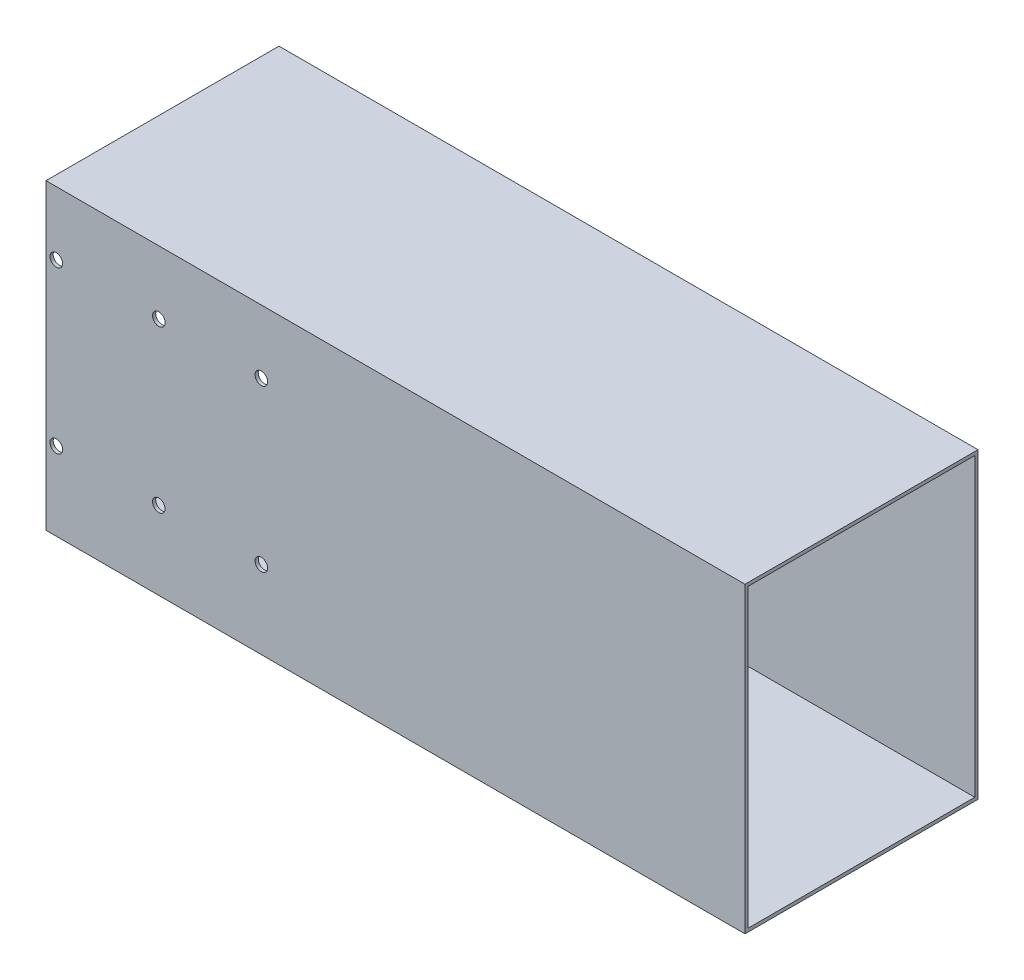
ISO-10303-21;
HEADER;
FILE_DESCRIPTION(('STEP AP214'),'2;1');
FILE_NAME('part.step','',(''),(''),'','','');
FILE_SCHEMA(('AUTOMOTIVE_DESIGN { 1 0 10303 214 1 1 1 1 }'));
ENDSEC;
DATA;
#1=APPLICATION_CONTEXT('core data for automotive mechanical design processes');
#2=APPLICATION_PROTOCOL_DEFINITION('international standard','automotive_design',2000,#1);
#3=PRODUCT_CONTEXT('',#1,'mechanical');
#4=PRODUCT('Part','Part','',(#3));
#5=PRODUCT_RELATED_PRODUCT_CATEGORY('part','',(#4));
#6=PRODUCT_DEFINITION_FORMATION('','',#4);
#7=PRODUCT_DEFINITION_CONTEXT('part definition',#1,'design');
#8=PRODUCT_DEFINITION('design','',#6,#7);
#9=PRODUCT_DEFINITION_SHAPE('','',#8);
#10=(LENGTH_UNIT() NAMED_UNIT(*) SI_UNIT(.MILLI.,.METRE.));
#11=(NAMED_UNIT(*) PLANE_ANGLE_UNIT() SI_UNIT($,.RADIAN.));
#12=(NAMED_UNIT(*) SI_UNIT($,.STERADIAN.) SOLID_ANGLE_UNIT());
#13=UNCERTAINTY_MEASURE_WITH_UNIT(LENGTH_MEASURE(1.E-05),#10,'distance_accuracy_value','');
#14=(GEOMETRIC_REPRESENTATION_CONTEXT(3) GLOBAL_UNCERTAINTY_ASSIGNED_CONTEXT((#13)) GLOBAL_UNIT_ASSIGNED_CONTEXT((#10,
#11,#12)) REPRESENTATION_CONTEXT('',''));
#15=CARTESIAN_POINT('',(0.,0.,0.));
#16=DIRECTION('',(0.,0.,1.));
#17=DIRECTION('',(1.,0.,0.));
#18=AXIS2_PLACEMENT_3D('',#15,#16,#17);
#19=CARTESIAN_POINT('',(-11.7023765952702,-3.63870772259184,50.));
#20=DIRECTION('',(0.,0.,-1.));
#21=DIRECTION('',(-1.,0.,0.));
#22=AXIS2_PLACEMENT_3D('',#19,#20,#21);
#23=CYLINDRICAL_SURFACE('',#22,1.35);
#24=CARTESIAN_POINT('',(-11.7023765952702,-3.63870772259184,0.682946832849751));
#25=DIRECTION('',(0.,0.,-1.));
#26=DIRECTION('',(-1.,0.,0.));
#27=AXIS2_PLACEMENT_3D('',#24,#25,#26);
#28=CIRCLE('',#27,1.35);
#29=CARTESIAN_POINT('',(-13.0523765952702,-3.63870772259184,0.682946832849751));
#30=VERTEX_POINT('',#29);
#31=EDGE_CURVE('E192',#30,#30,#28,.T.);
#32=ORIENTED_EDGE('',*,*,#31,.F.);
#33=EDGE_LOOP('',(#32));
#34=FACE_BOUND('',#33,.T.);
#35=CARTESIAN_POINT('',(-11.7023765952702,-3.63870772259184,0.));
#36=DIRECTION('',(0.,0.,1.));
#37=DIRECTION('',(1.,0.,0.));
#38=AXIS2_PLACEMENT_3D('',#35,#36,#37);
#39=CIRCLE('',#38,1.35);
#40=CARTESIAN_POINT('',(-10.3523765952702,-3.63870772259184,0.));
#41=VERTEX_POINT('',#40);
#42=EDGE_CURVE('E249',#41,#41,#39,.T.);
#43=ORIENTED_EDGE('',*,*,#42,.F.);
#44=EDGE_LOOP('',(#43));
#45=FACE_BOUND('',#44,.T.);
#46=ADVANCED_FACE('F39',(#34,#45),#23,.F.);
#47=CARTESIAN_POINT('',(10.2976234047298,-3.63870772259184,50.));
#48=DIRECTION('',(0.,0.,-1.));
#49=DIRECTION('',(-1.,0.,0.));
#50=AXIS2_PLACEMENT_3D('',#47,#48,#49);
#51=CYLINDRICAL_SURFACE('',#50,1.35);
#52=CARTESIAN_POINT('',(10.2976234047298,-3.63870772259184,0.682946832849751));
#53=DIRECTION('',(0.,0.,-1.));
#54=DIRECTION('',(-1.,0.,0.));
#55=AXIS2_PLACEMENT_3D('',#52,#53,#54);
#56=CIRCLE('',#55,1.35);
#57=CARTESIAN_POINT('',(8.94762340472977,-3.63870772259184,0.682946832849751));
#58=VERTEX_POINT('',#57);
#59=EDGE_CURVE('E188',#58,#58,#56,.T.);
#60=ORIENTED_EDGE('',*,*,#59,.F.);
#61=EDGE_LOOP('',(#60));
#62=FACE_BOUND('',#61,.T.);
#63=CARTESIAN_POINT('',(10.2976234047298,-3.63870772259184,0.));
#64=DIRECTION('',(0.,0.,1.));
#65=DIRECTION('',(1.,0.,0.));
#66=AXIS2_PLACEMENT_3D('',#63,#64,#65);
#67=CIRCLE('',#66,1.35);
#68=CARTESIAN_POINT('',(11.6476234047298,-3.63870772259184,0.));
#69=VERTEX_POINT('',#68);
#70=EDGE_CURVE('E241',#69,#69,#67,.T.);
#71=ORIENTED_EDGE('',*,*,#70,.F.);
#72=EDGE_LOOP('',(#71));
#73=FACE_BOUND('',#72,.T.);
#74=ADVANCED_FACE('F311',(#62,#73),#51,.F.);
#75=CARTESIAN_POINT('',(32.2976234047298,-3.63870772259184,50.));
#76=DIRECTION('',(0.,0.,-1.));
#77=DIRECTION('',(-1.,0.,0.));
#78=AXIS2_PLACEMENT_3D('',#75,#76,#77);
#79=CYLINDRICAL_SURFACE('',#78,1.35);
#80=CARTESIAN_POINT('',(32.2976234047298,-3.63870772259184,0.682946832849751));
#81=DIRECTION('',(0.,0.,-1.));
#82=DIRECTION('',(-1.,0.,0.));
#83=AXIS2_PLACEMENT_3D('',#80,#81,#82);
#84=CIRCLE('',#83,1.35);
#85=CARTESIAN_POINT('',(30.9476234047298,-3.63870772259184,0.682946832849751));
#86=VERTEX_POINT('',#85);
#87=EDGE_CURVE('E184',#86,#86,#84,.T.);
#88=ORIENTED_EDGE('',*,*,#87,.F.);
#89=EDGE_LOOP('',(#88));
#90=FACE_BOUND('',#89,.T.);
#91=CARTESIAN_POINT('',(32.2976234047298,-3.63870772259184,0.));
#92=DIRECTION('',(0.,0.,1.));
#93=DIRECTION('',(1.,0.,0.));
#94=AXIS2_PLACEMENT_3D('',#91,#92,#93);
#95=CIRCLE('',#94,1.35);
#96=CARTESIAN_POINT('',(33.6476234047298,-3.63870772259184,0.));
#97=VERTEX_POINT('',#96);
#98=EDGE_CURVE('E233',#97,#97,#95,.T.);
#99=ORIENTED_EDGE('',*,*,#98,.F.);
#100=EDGE_LOOP('',(#99));
#101=FACE_BOUND('',#100,.T.);
#102=ADVANCED_FACE('F317',(#90,#101),#79,.F.);
#103=CARTESIAN_POINT('',(32.2976234047298,30.9612922774082,50.));
#104=DIRECTION('',(0.,0.,-1.));
#105=DIRECTION('',(-1.,0.,0.));
#106=AXIS2_PLACEMENT_3D('',#103,#104,#105);
#107=CYLINDRICAL_SURFACE('',#106,1.35);
#108=CARTESIAN_POINT('',(32.2976234047298,30.9612922774082,0.682946832849751));
#109=DIRECTION('',(0.,0.,-1.));
#110=DIRECTION('',(-1.,0.,0.));
#111=AXIS2_PLACEMENT_3D('',#108,#109,#110);
#112=CIRCLE('',#111,1.35);
#113=CARTESIAN_POINT('',(30.9476234047298,30.9612922774082,0.682946832849751));
#114=VERTEX_POINT('',#113);
#115=EDGE_CURVE('E180',#114,#114,#112,.T.);
#116=ORIENTED_EDGE('',*,*,#115,.F.);
#117=EDGE_LOOP('',(#116));
#118=FACE_BOUND('',#117,.T.);
#119=CARTESIAN_POINT('',(32.2976234047298,30.9612922774082,0.));
#120=DIRECTION('',(0.,0.,1.));
#121=DIRECTION('',(-1.,0.,0.));
#122=AXIS2_PLACEMENT_3D('',#119,#120,#121);
#123=CIRCLE('',#122,1.35);
#124=CARTESIAN_POINT('',(30.9476234047298,30.9612922774082,0.));
#125=VERTEX_POINT('',#124);
#126=EDGE_CURVE('E225',#125,#125,#123,.T.);
#127=ORIENTED_EDGE('',*,*,#126,.F.);
#128=EDGE_LOOP('',(#127));
#129=FACE_BOUND('',#128,.T.);
#130=ADVANCED_FACE('F355',(#118,#129),#107,.F.);
#131=CARTESIAN_POINT('',(10.2976234047298,30.9612922774082,50.));
#132=DIRECTION('',(0.,0.,-1.));
#133=DIRECTION('',(-1.,0.,0.));
#134=AXIS2_PLACEMENT_3D('',#131,#132,#133);
#135=CYLINDRICAL_SURFACE('',#134,1.35);
#136=CARTESIAN_POINT('',(10.2976234047298,30.9612922774082,0.682946832849751));
#137=DIRECTION('',(0.,0.,-1.));
#138=DIRECTION('',(-1.,0.,0.));
#139=AXIS2_PLACEMENT_3D('',#136,#137,#138);
#140=CIRCLE('',#139,1.35);
#141=CARTESIAN_POINT('',(8.94762340472977,30.9612922774082,0.682946832849751));
#142=VERTEX_POINT('',#141);
#143=EDGE_CURVE('E176',#142,#142,#140,.T.);
#144=ORIENTED_EDGE('',*,*,#143,.F.);
#145=EDGE_LOOP('',(#144));
#146=FACE_BOUND('',#145,.T.);
#147=CARTESIAN_POINT('',(10.2976234047298,30.9612922774082,0.));
#148=DIRECTION('',(0.,0.,1.));
#149=DIRECTION('',(-1.,0.,0.));
#150=AXIS2_PLACEMENT_3D('',#147,#148,#149);
#151=CIRCLE('',#150,1.35);
#152=CARTESIAN_POINT('',(8.94762340472977,30.9612922774082,0.));
#153=VERTEX_POINT('',#152);
#154=EDGE_CURVE('E217',#153,#153,#151,.T.);
#155=ORIENTED_EDGE('',*,*,#154,.F.);
#156=EDGE_LOOP('',(#155));
#157=FACE_BOUND('',#156,.T.);
#158=ADVANCED_FACE('F306',(#146,#157),#135,.F.);
#159=CARTESIAN_POINT('',(-11.7023765952702,30.9612922774082,50.));
#160=DIRECTION('',(0.,0.,-1.));
#161=DIRECTION('',(-1.,0.,0.));
#162=AXIS2_PLACEMENT_3D('',#159,#160,#161);
#163=CYLINDRICAL_SURFACE('',#162,1.35);
#164=CARTESIAN_POINT('',(-11.7023765952702,30.9612922774082,0.682946832849751));
#165=DIRECTION('',(0.,0.,-1.));
#166=DIRECTION('',(-1.,0.,0.));
#167=AXIS2_PLACEMENT_3D('',#164,#165,#166);
#168=CIRCLE('',#167,1.35);
#169=CARTESIAN_POINT('',(-13.0523765952702,30.9612922774082,0.682946832849751));
#170=VERTEX_POINT('',#169);
#171=EDGE_CURVE('E43',#170,#170,#168,.T.);
#172=ORIENTED_EDGE('',*,*,#171,.F.);
#173=EDGE_LOOP('',(#172));
#174=FACE_BOUND('',#173,.T.);
#175=CARTESIAN_POINT('',(-11.7023765952702,30.9612922774082,0.));
#176=DIRECTION('',(0.,0.,1.));
#177=DIRECTION('',(-1.,0.,0.));
#178=AXIS2_PLACEMENT_3D('',#175,#176,#177);
#179=CIRCLE('',#178,1.35);
#180=CARTESIAN_POINT('',(-13.0523765952702,30.9612922774082,0.));
#181=VERTEX_POINT('',#180);
#182=EDGE_CURVE('E209',#181,#181,#179,.T.);
#183=ORIENTED_EDGE('',*,*,#182,.F.);
#184=EDGE_LOOP('',(#183));
#185=FACE_BOUND('',#184,.T.);
#186=ADVANCED_FACE('F292',(#174,#185),#163,.F.);
#187=CARTESIAN_POINT('',(0.,0.,50.));
#188=DIRECTION('',(0.,0.,-1.));
#189=DIRECTION('',(-1.,0.,0.));
#190=AXIS2_PLACEMENT_3D('',#187,#188,#189);
#191=PLANE('',#190);
#192=DIRECTION('',(0.,-1.,0.));
#193=VECTOR('',#192,1.);
#194=CARTESIAN_POINT('',(-13.9144175245016,44.5867927781406,50.));
#195=LINE('',#194,#193);
#196=CARTESIAN_POINT('',(-13.9144175245016,44.5867927781406,50.));
#197=VERTEX_POINT('',#196);
#198=CARTESIAN_POINT('',(-13.9144175245016,-20.3915923759137,50.));
#199=VERTEX_POINT('',#198);
#200=EDGE_CURVE('E261',#197,#199,#195,.T.);
#201=ORIENTED_EDGE('',*,*,#200,.T.);
#202=DIRECTION('',(1.,0.,0.));
#203=VECTOR('',#202,1.);
#204=CARTESIAN_POINT('',(-13.9144175245016,-20.3915923759137,50.));
#205=LINE('',#204,#203);
#206=CARTESIAN_POINT('',(136.085582475498,-20.3915923759137,50.));
#207=VERTEX_POINT('',#206);
#208=EDGE_CURVE('E196',#199,#207,#205,.T.);
#209=ORIENTED_EDGE('',*,*,#208,.T.);
#210=DIRECTION('',(0.,1.,0.));
#211=VECTOR('',#210,1.);
#212=CARTESIAN_POINT('',(136.085582475498,44.5867927781406,50.));
#213=LINE('',#212,#211);
#214=CARTESIAN_POINT('',(136.085582475498,44.5867927781406,50.));
#215=VERTEX_POINT('',#214);
#216=EDGE_CURVE('E264',#207,#215,#213,.T.);
#217=ORIENTED_EDGE('',*,*,#216,.T.);
#218=DIRECTION('',(-1.,0.,0.));
#219=VECTOR('',#218,1.);
#220=CARTESIAN_POINT('',(136.085582475498,44.5867927781406,50.));
#221=LINE('',#220,#219);
#222=EDGE_CURVE('E268',#215,#197,#221,.T.);
#223=ORIENTED_EDGE('',*,*,#222,.T.);
#224=EDGE_LOOP('',(#201,#209,#217,#223));
#225=FACE_BOUND('',#224,.T.);
#226=CARTESIAN_POINT('',(-11.7023765952702,-3.63870772259184,50.));
#227=DIRECTION('',(0.,0.,1.));
#228=DIRECTION('',(1.,0.,0.));
#229=AXIS2_PLACEMENT_3D('',#226,#227,#228);
#230=CIRCLE('',#229,1.35);
#231=CARTESIAN_POINT('',(-10.3523765952702,-3.63870772259184,50.));
#232=VERTEX_POINT('',#231);
#233=EDGE_CURVE('E253',#232,#232,#230,.T.);
#234=ORIENTED_EDGE('',*,*,#233,.F.);
#235=EDGE_LOOP('',(#234));
#236=FACE_BOUND('',#235,.T.);
#237=CARTESIAN_POINT('',(10.2976234047298,-3.63870772259184,50.));
#238=DIRECTION('',(0.,0.,1.));
#239=DIRECTION('',(1.,0.,0.));
#240=AXIS2_PLACEMENT_3D('',#237,#238,#239);
#241=CIRCLE('',#240,1.35);
#242=CARTESIAN_POINT('',(11.6476234047298,-3.63870772259184,50.));
#243=VERTEX_POINT('',#242);
#244=EDGE_CURVE('E245',#243,#243,#241,.T.);
#245=ORIENTED_EDGE('',*,*,#244,.F.);
#246=EDGE_LOOP('',(#245));
#247=FACE_BOUND('',#246,.T.);
#248=CARTESIAN_POINT('',(32.2976234047298,-3.63870772259184,50.));
#249=DIRECTION('',(0.,0.,1.));
#250=DIRECTION('',(1.,0.,0.));
#251=AXIS2_PLACEMENT_3D('',#248,#249,#250);
#252=CIRCLE('',#251,1.35);
#253=CARTESIAN_POINT('',(33.6476234047298,-3.63870772259184,50.));
#254=VERTEX_POINT('',#253);
#255=EDGE_CURVE('E237',#254,#254,#252,.T.);
#256=ORIENTED_EDGE('',*,*,#255,.F.);
#257=EDGE_LOOP('',(#256));
#258=FACE_BOUND('',#257,.T.);
#259=CARTESIAN_POINT('',(32.2976234047298,30.9612922774082,50.));
#260=DIRECTION('',(0.,0.,1.));
#261=DIRECTION('',(-1.,0.,0.));
#262=AXIS2_PLACEMENT_3D('',#259,#260,#261);
#263=CIRCLE('',#262,1.35);
#264=CARTESIAN_POINT('',(30.9476234047298,30.9612922774082,50.));
#265=VERTEX_POINT('',#264);
#266=EDGE_CURVE('E229',#265,#265,#263,.T.);
#267=ORIENTED_EDGE('',*,*,#266,.F.);
#268=EDGE_LOOP('',(#267));
#269=FACE_BOUND('',#268,.T.);
#270=CARTESIAN_POINT('',(10.2976234047298,30.9612922774082,50.));
#271=DIRECTION('',(0.,0.,1.));
#272=DIRECTION('',(-1.,0.,0.));
#273=AXIS2_PLACEMENT_3D('',#270,#271,#272);
#274=CIRCLE('',#273,1.35);
#275=CARTESIAN_POINT('',(8.94762340472977,30.9612922774082,50.));
#276=VERTEX_POINT('',#275);
#277=EDGE_CURVE('E221',#276,#276,#274,.T.);
#278=ORIENTED_EDGE('',*,*,#277,.F.);
#279=EDGE_LOOP('',(#278));
#280=FACE_BOUND('',#279,.T.);
#281=CARTESIAN_POINT('',(-11.7023765952702,30.9612922774082,50.));
#282=DIRECTION('',(0.,0.,1.));
#283=DIRECTION('',(-1.,0.,0.));
#284=AXIS2_PLACEMENT_3D('',#281,#282,#283);
#285=CIRCLE('',#284,1.35);
#286=CARTESIAN_POINT('',(-13.0523765952702,30.9612922774082,50.));
#287=VERTEX_POINT('',#286);
#288=EDGE_CURVE('E213',#287,#287,#285,.T.);
#289=ORIENTED_EDGE('',*,*,#288,.F.);
#290=EDGE_LOOP('',(#289));
#291=FACE_BOUND('',#290,.T.);
#292=ADVANCED_FACE('F295',(#225,#236,#247,#258,#269,#280,#291),#191,.F.);
#293=CARTESIAN_POINT('',(0.,0.,0.));
#294=DIRECTION('',(0.,0.,-1.));
#295=DIRECTION('',(-1.,0.,0.));
#296=AXIS2_PLACEMENT_3D('',#293,#294,#295);
#297=PLANE('',#296);
#298=ORIENTED_EDGE('',*,*,#154,.T.);
#299=EDGE_LOOP('',(#298));
#300=FACE_BOUND('',#299,.T.);
#301=ORIENTED_EDGE('',*,*,#98,.T.);
#302=EDGE_LOOP('',(#301));
#303=FACE_BOUND('',#302,.T.);
#304=ORIENTED_EDGE('',*,*,#42,.T.);
#305=EDGE_LOOP('',(#304));
#306=FACE_BOUND('',#305,.T.);
#307=DIRECTION('',(0.,-1.,0.));
#308=VECTOR('',#307,1.);
#309=CARTESIAN_POINT('',(-13.9144175245016,44.5867927781406,0.));
#310=LINE('',#309,#308);
#311=CARTESIAN_POINT('',(-13.9144175245016,44.5867927781406,0.));
#312=VERTEX_POINT('',#311);
#313=CARTESIAN_POINT('',(-13.9144175245016,-20.3915923759137,0.));
#314=VERTEX_POINT('',#313);
#315=EDGE_CURVE('E257',#312,#314,#310,.T.);
#316=ORIENTED_EDGE('',*,*,#315,.F.);
#317=DIRECTION('',(-1.,0.,0.));
#318=VECTOR('',#317,1.);
#319=CARTESIAN_POINT('',(136.085582475498,44.5867927781406,0.));
#320=LINE('',#319,#318);
#321=CARTESIAN_POINT('',(136.085582475498,44.5867927781406,0.));
#322=VERTEX_POINT('',#321);
#323=EDGE_CURVE('E265',#322,#312,#320,.T.);
#324=ORIENTED_EDGE('',*,*,#323,.F.);
#325=DIRECTION('',(0.,1.,0.));
#326=VECTOR('',#325,1.);
#327=CARTESIAN_POINT('',(136.085582475498,44.5867927781406,0.));
#328=LINE('',#327,#326);
#329=CARTESIAN_POINT('',(136.085582475498,-20.3915923759137,0.));
#330=VERTEX_POINT('',#329);
#331=EDGE_CURVE('E273',#330,#322,#328,.T.);
#332=ORIENTED_EDGE('',*,*,#331,.F.);
#333=DIRECTION('',(1.,0.,0.));
#334=VECTOR('',#333,1.);
#335=CARTESIAN_POINT('',(-13.9144175245016,-20.3915923759137,0.));
#336=LINE('',#335,#334);
#337=EDGE_CURVE('E197',#314,#330,#336,.T.);
#338=ORIENTED_EDGE('',*,*,#337,.F.);
#339=EDGE_LOOP('',(#316,#324,#332,#338));
#340=FACE_BOUND('',#339,.T.);
#341=ORIENTED_EDGE('',*,*,#70,.T.);
#342=EDGE_LOOP('',(#341));
#343=FACE_BOUND('',#342,.T.);
#344=ORIENTED_EDGE('',*,*,#126,.T.);
#345=EDGE_LOOP('',(#344));
#346=FACE_BOUND('',#345,.T.);
#347=ORIENTED_EDGE('',*,*,#182,.T.);
#348=EDGE_LOOP('',(#347));
#349=FACE_BOUND('',#348,.T.);
#350=ADVANCED_FACE('F297',(#300,#303,#306,#340,#343,#346,#349),#297,.T.);
#351=CARTESIAN_POINT('',(-13.9144175245016,44.5867927781406,50.));
#352=DIRECTION('',(1.,0.,0.));
#353=DIRECTION('',(0.,1.,0.));
#354=AXIS2_PLACEMENT_3D('',#351,#352,#353);
#355=PLANE('',#354);
#356=DIRECTION('',(0.,0.,1.));
#357=VECTOR('',#356,1.);
#358=CARTESIAN_POINT('',(-13.9144175245016,-19.6668182580724,49.3170531671502));
#359=LINE('',#358,#357);
#360=CARTESIAN_POINT('',(-13.9144175245016,-19.6668182580724,0.682946832849751));
#361=VERTEX_POINT('',#360);
#362=CARTESIAN_POINT('',(-13.9144175245016,-19.6668182580724,49.3170531671502));
#363=VERTEX_POINT('',#362);
#364=EDGE_CURVE('E141',#361,#363,#359,.T.);
#365=ORIENTED_EDGE('',*,*,#364,.F.);
#366=DIRECTION('',(0.,-1.,0.));
#367=VECTOR('',#366,1.);
#368=CARTESIAN_POINT('',(-13.9144175245016,43.8620186602992,0.682946832849751));
#369=LINE('',#368,#367);
#370=CARTESIAN_POINT('',(-13.9144175245016,43.8620186602992,0.682946832849751));
#371=VERTEX_POINT('',#370);
#372=EDGE_CURVE('E57',#371,#361,#369,.T.);
#373=ORIENTED_EDGE('',*,*,#372,.F.);
#374=DIRECTION('',(0.,0.,-1.));
#375=VECTOR('',#374,1.);
#376=CARTESIAN_POINT('',(-13.9144175245016,43.8620186602992,49.3170531671502));
#377=LINE('',#376,#375);
#378=CARTESIAN_POINT('',(-13.9144175245016,43.8620186602992,49.3170531671502));
#379=VERTEX_POINT('',#378);
#380=EDGE_CURVE('E128',#379,#371,#377,.T.);
#381=ORIENTED_EDGE('',*,*,#380,.F.);
#382=DIRECTION('',(0.,1.,0.));
#383=VECTOR('',#382,1.);
#384=CARTESIAN_POINT('',(-13.9144175245016,43.8620186602992,49.3170531671502));
#385=LINE('',#384,#383);
#386=EDGE_CURVE('E132',#363,#379,#385,.T.);
#387=ORIENTED_EDGE('',*,*,#386,.F.);
#388=EDGE_LOOP('',(#365,#373,#381,#387));
#389=FACE_BOUND('',#388,.T.);
#390=ORIENTED_EDGE('',*,*,#315,.T.);
#391=DIRECTION('',(0.,0.,1.));
#392=VECTOR('',#391,1.);
#393=CARTESIAN_POINT('',(-13.9144175245016,-20.3915923759137,0.));
#394=LINE('',#393,#392);
#395=EDGE_CURVE('E201',#314,#199,#394,.T.);
#396=ORIENTED_EDGE('',*,*,#395,.T.);
#397=ORIENTED_EDGE('',*,*,#200,.F.);
#398=DIRECTION('',(0.,0.,-1.));
#399=VECTOR('',#398,1.);
#400=CARTESIAN_POINT('',(-13.9144175245016,44.5867927781406,50.));
#401=LINE('',#400,#399);
#402=EDGE_CURVE('E49',#197,#312,#401,.T.);
#403=ORIENTED_EDGE('',*,*,#402,.T.);
#404=EDGE_LOOP('',(#390,#396,#397,#403));
#405=FACE_BOUND('',#404,.T.);
#406=ADVANCED_FACE('F41',(#389,#405),#355,.F.);
#407=CARTESIAN_POINT('',(136.085582475498,44.5867927781406,50.));
#408=DIRECTION('',(-1.,0.,0.));
#409=DIRECTION('',(0.,0.,1.));
#410=AXIS2_PLACEMENT_3D('',#407,#408,#409);
#411=PLANE('',#410);
#412=DIRECTION('',(0.,0.,-1.));
#413=VECTOR('',#412,1.);
#414=CARTESIAN_POINT('',(136.085582475498,43.8620186602993,49.3170531671502));
#415=LINE('',#414,#413);
#416=CARTESIAN_POINT('',(136.085582475498,43.8620186602993,49.3170531671502));
#417=VERTEX_POINT('',#416);
#418=CARTESIAN_POINT('',(136.085582475498,43.8620186602993,0.682946832849751));
#419=VERTEX_POINT('',#418);
#420=EDGE_CURVE('E116',#417,#419,#415,.T.);
#421=ORIENTED_EDGE('',*,*,#420,.T.);
#422=DIRECTION('',(0.,-1.,0.));
#423=VECTOR('',#422,1.);
#424=CARTESIAN_POINT('',(136.085582475498,43.8620186602993,0.682946832849751));
#425=LINE('',#424,#423);
#426=CARTESIAN_POINT('',(136.085582475498,-19.6668182580724,0.682946832849751));
#427=VERTEX_POINT('',#426);
#428=EDGE_CURVE('E109',#419,#427,#425,.T.);
#429=ORIENTED_EDGE('',*,*,#428,.T.);
#430=DIRECTION('',(0.,0.,1.));
#431=VECTOR('',#430,1.);
#432=CARTESIAN_POINT('',(136.085582475498,-19.6668182580724,49.3170531671502));
#433=LINE('',#432,#431);
#434=CARTESIAN_POINT('',(136.085582475498,-19.6668182580724,49.3170531671502));
#435=VERTEX_POINT('',#434);
#436=EDGE_CURVE('E119',#427,#435,#433,.T.);
#437=ORIENTED_EDGE('',*,*,#436,.T.);
#438=DIRECTION('',(0.,1.,0.));
#439=VECTOR('',#438,1.);
#440=CARTESIAN_POINT('',(136.085582475498,43.8620186602993,49.3170531671502));
#441=LINE('',#440,#439);
#442=EDGE_CURVE('E65',#435,#417,#441,.T.);
#443=ORIENTED_EDGE('',*,*,#442,.T.);
#444=EDGE_LOOP('',(#421,#429,#437,#443));
#445=FACE_BOUND('',#444,.T.);
#446=ORIENTED_EDGE('',*,*,#331,.T.);
#447=DIRECTION('',(0.,0.,-1.));
#448=VECTOR('',#447,1.);
#449=CARTESIAN_POINT('',(136.085582475498,44.5867927781406,50.));
#450=LINE('',#449,#448);
#451=EDGE_CURVE('E11',#215,#322,#450,.T.);
#452=ORIENTED_EDGE('',*,*,#451,.F.);
#453=ORIENTED_EDGE('',*,*,#216,.F.);
#454=DIRECTION('',(0.,0.,1.));
#455=VECTOR('',#454,1.);
#456=CARTESIAN_POINT('',(136.085582475498,-20.3915923759137,0.));
#457=LINE('',#456,#455);
#458=EDGE_CURVE('E205',#330,#207,#457,.T.);
#459=ORIENTED_EDGE('',*,*,#458,.F.);
#460=EDGE_LOOP('',(#446,#452,#453,#459));
#461=FACE_BOUND('',#460,.T.);
#462=ADVANCED_FACE('F124',(#445,#461),#411,.F.);
#463=CARTESIAN_POINT('',(136.085582475498,44.5867927781406,50.));
#464=DIRECTION('',(0.,-1.,0.));
#465=DIRECTION('',(1.,0.,0.));
#466=AXIS2_PLACEMENT_3D('',#463,#464,#465);
#467=PLANE('',#466);
#468=ORIENTED_EDGE('',*,*,#323,.T.);
#469=ORIENTED_EDGE('',*,*,#402,.F.);
#470=ORIENTED_EDGE('',*,*,#222,.F.);
#471=ORIENTED_EDGE('',*,*,#451,.T.);
#472=EDGE_LOOP('',(#468,#469,#470,#471));
#473=FACE_BOUND('',#472,.T.);
#474=ADVANCED_FACE('F324',(#473),#467,.F.);
#475=CARTESIAN_POINT('',(-11.7023765952702,-3.63870772259184,49.3170531671502));
#476=DIRECTION('',(0.,0.,1.));
#477=DIRECTION('',(1.,0.,0.));
#478=AXIS2_PLACEMENT_3D('',#475,#476,#477);
#479=CIRCLE('',#478,1.35);
#480=CARTESIAN_POINT('',(-10.3523765952702,-3.63870772259184,49.3170531671502));
#481=VERTEX_POINT('',#480);
#482=EDGE_CURVE('E172',#481,#481,#479,.T.);
#483=ORIENTED_EDGE('',*,*,#482,.F.);
#484=EDGE_LOOP('',(#483));
#485=FACE_BOUND('',#484,.T.);
#486=ORIENTED_EDGE('',*,*,#233,.T.);
#487=EDGE_LOOP('',(#486));
#488=FACE_BOUND('',#487,.T.);
#489=ADVANCED_FACE('F313',(#485,#488),#23,.F.);
#490=CARTESIAN_POINT('',(10.2976234047298,-3.63870772259184,49.3170531671502));
#491=DIRECTION('',(0.,0.,1.));
#492=DIRECTION('',(1.,0.,0.));
#493=AXIS2_PLACEMENT_3D('',#490,#491,#492);
#494=CIRCLE('',#493,1.35);
#495=CARTESIAN_POINT('',(11.6476234047298,-3.63870772259184,49.3170531671502));
#496=VERTEX_POINT('',#495);
#497=EDGE_CURVE('E168',#496,#496,#494,.T.);
#498=ORIENTED_EDGE('',*,*,#497,.F.);
#499=EDGE_LOOP('',(#498));
#500=FACE_BOUND('',#499,.T.);
#501=ORIENTED_EDGE('',*,*,#244,.T.);
#502=EDGE_LOOP('',(#501));
#503=FACE_BOUND('',#502,.T.);
#504=ADVANCED_FACE('F320',(#500,#503),#51,.F.);
#505=CARTESIAN_POINT('',(32.2976234047298,-3.63870772259184,49.3170531671502));
#506=DIRECTION('',(0.,0.,1.));
#507=DIRECTION('',(1.,0.,0.));
#508=AXIS2_PLACEMENT_3D('',#505,#506,#507);
#509=CIRCLE('',#508,1.35);
#510=CARTESIAN_POINT('',(33.6476234047298,-3.63870772259184,49.3170531671502));
#511=VERTEX_POINT('',#510);
#512=EDGE_CURVE('E164',#511,#511,#509,.T.);
#513=ORIENTED_EDGE('',*,*,#512,.F.);
#514=EDGE_LOOP('',(#513));
#515=FACE_BOUND('',#514,.T.);
#516=ORIENTED_EDGE('',*,*,#255,.T.);
#517=EDGE_LOOP('',(#516));
#518=FACE_BOUND('',#517,.T.);
#519=ADVANCED_FACE('F330',(#515,#518),#79,.F.);
#520=CARTESIAN_POINT('',(32.2976234047298,30.9612922774082,49.3170531671502));
#521=DIRECTION('',(0.,0.,1.));
#522=DIRECTION('',(1.,0.,0.));
#523=AXIS2_PLACEMENT_3D('',#520,#521,#522);
#524=CIRCLE('',#523,1.35);
#525=CARTESIAN_POINT('',(33.6476234047298,30.9612922774082,49.3170531671502));
#526=VERTEX_POINT('',#525);
#527=EDGE_CURVE('E160',#526,#526,#524,.T.);
#528=ORIENTED_EDGE('',*,*,#527,.F.);
#529=EDGE_LOOP('',(#528));
#530=FACE_BOUND('',#529,.T.);
#531=ORIENTED_EDGE('',*,*,#266,.T.);
#532=EDGE_LOOP('',(#531));
#533=FACE_BOUND('',#532,.T.);
#534=ADVANCED_FACE('F347',(#530,#533),#107,.F.);
#535=CARTESIAN_POINT('',(10.2976234047298,30.9612922774082,49.3170531671502));
#536=DIRECTION('',(0.,0.,1.));
#537=DIRECTION('',(1.,0.,0.));
#538=AXIS2_PLACEMENT_3D('',#535,#536,#537);
#539=CIRCLE('',#538,1.35);
#540=CARTESIAN_POINT('',(11.6476234047298,30.9612922774082,49.3170531671502));
#541=VERTEX_POINT('',#540);
#542=EDGE_CURVE('E156',#541,#541,#539,.T.);
#543=ORIENTED_EDGE('',*,*,#542,.F.);
#544=EDGE_LOOP('',(#543));
#545=FACE_BOUND('',#544,.T.);
#546=ORIENTED_EDGE('',*,*,#277,.T.);
#547=EDGE_LOOP('',(#546));
#548=FACE_BOUND('',#547,.T.);
#549=ADVANCED_FACE('F290',(#545,#548),#135,.F.);
#550=CARTESIAN_POINT('',(-11.7023765952702,30.9612922774082,49.3170531671502));
#551=DIRECTION('',(0.,0.,1.));
#552=DIRECTION('',(1.,0.,0.));
#553=AXIS2_PLACEMENT_3D('',#550,#551,#552);
#554=CIRCLE('',#553,1.35);
#555=CARTESIAN_POINT('',(-10.3523765952702,30.9612922774082,49.3170531671502));
#556=VERTEX_POINT('',#555);
#557=EDGE_CURVE('E150',#556,#556,#554,.T.);
#558=ORIENTED_EDGE('',*,*,#557,.F.);
#559=EDGE_LOOP('',(#558));
#560=FACE_BOUND('',#559,.T.);
#561=ORIENTED_EDGE('',*,*,#288,.T.);
#562=EDGE_LOOP('',(#561));
#563=FACE_BOUND('',#562,.T.);
#564=ADVANCED_FACE('F286',(#560,#563),#163,.F.);
#565=CARTESIAN_POINT('',(-13.9144175245016,-20.3915923759137,0.));
#566=DIRECTION('',(0.,-1.,0.));
#567=DIRECTION('',(0.,0.,-1.));
#568=AXIS2_PLACEMENT_3D('',#565,#566,#567);
#569=PLANE('',#568);
#570=ORIENTED_EDGE('',*,*,#208,.F.);
#571=ORIENTED_EDGE('',*,*,#395,.F.);
#572=ORIENTED_EDGE('',*,*,#337,.T.);
#573=ORIENTED_EDGE('',*,*,#458,.T.);
#574=EDGE_LOOP('',(#570,#571,#572,#573));
#575=FACE_BOUND('',#574,.T.);
#576=ADVANCED_FACE('F289',(#575),#569,.T.);
#577=CARTESIAN_POINT('',(136.085582475498,43.8620186602993,0.682946832849751));
#578=DIRECTION('',(0.,0.,-1.));
#579=DIRECTION('',(-1.,0.,0.));
#580=AXIS2_PLACEMENT_3D('',#577,#578,#579);
#581=PLANE('',#580);
#582=ORIENTED_EDGE('',*,*,#31,.T.);
#583=EDGE_LOOP('',(#582));
#584=FACE_BOUND('',#583,.T.);
#585=ORIENTED_EDGE('',*,*,#59,.T.);
#586=EDGE_LOOP('',(#585));
#587=FACE_BOUND('',#586,.T.);
#588=ORIENTED_EDGE('',*,*,#87,.T.);
#589=EDGE_LOOP('',(#588));
#590=FACE_BOUND('',#589,.T.);
#591=ORIENTED_EDGE('',*,*,#115,.T.);
#592=EDGE_LOOP('',(#591));
#593=FACE_BOUND('',#592,.T.);
#594=ORIENTED_EDGE('',*,*,#143,.T.);
#595=EDGE_LOOP('',(#594));
#596=FACE_BOUND('',#595,.T.);
#597=ORIENTED_EDGE('',*,*,#171,.T.);
#598=EDGE_LOOP('',(#597));
#599=FACE_BOUND('',#598,.T.);
#600=ORIENTED_EDGE('',*,*,#372,.T.);
#601=DIRECTION('',(-1.,0.,0.));
#602=VECTOR('',#601,1.);
#603=CARTESIAN_POINT('',(136.085582475498,-19.6668182580724,0.682946832849751));
#604=LINE('',#603,#602);
#605=EDGE_CURVE('E105',#427,#361,#604,.T.);
#606=ORIENTED_EDGE('',*,*,#605,.F.);
#607=ORIENTED_EDGE('',*,*,#428,.F.);
#608=DIRECTION('',(-1.,0.,0.));
#609=VECTOR('',#608,1.);
#610=CARTESIAN_POINT('',(136.085582475498,43.8620186602993,0.682946832849751));
#611=LINE('',#610,#609);
#612=EDGE_CURVE('E147',#419,#371,#611,.T.);
#613=ORIENTED_EDGE('',*,*,#612,.T.);
#614=EDGE_LOOP('',(#600,#606,#607,#613));
#615=FACE_BOUND('',#614,.T.);
#616=ADVANCED_FACE('F107',(#584,#587,#590,#593,#596,#599,#615),#581,.F.);
#617=CARTESIAN_POINT('',(136.085582475498,43.8620186602993,49.3170531671502));
#618=DIRECTION('',(0.,1.,0.));
#619=DIRECTION('',(-1.,0.,0.));
#620=AXIS2_PLACEMENT_3D('',#617,#618,#619);
#621=PLANE('',#620);
#622=ORIENTED_EDGE('',*,*,#380,.T.);
#623=ORIENTED_EDGE('',*,*,#612,.F.);
#624=ORIENTED_EDGE('',*,*,#420,.F.);
#625=DIRECTION('',(-1.,0.,0.));
#626=VECTOR('',#625,1.);
#627=CARTESIAN_POINT('',(136.085582475498,43.8620186602993,49.3170531671502));
#628=LINE('',#627,#626);
#629=EDGE_CURVE('E151',#417,#379,#628,.T.);
#630=ORIENTED_EDGE('',*,*,#629,.T.);
#631=EDGE_LOOP('',(#622,#623,#624,#630));
#632=FACE_BOUND('',#631,.T.);
#633=ADVANCED_FACE('F402',(#632),#621,.F.);
#634=CARTESIAN_POINT('',(136.085582475498,43.8620186602993,49.3170531671502));
#635=DIRECTION('',(0.,0.,1.));
#636=DIRECTION('',(1.,0.,0.));
#637=AXIS2_PLACEMENT_3D('',#634,#635,#636);
#638=PLANE('',#637);
#639=ORIENTED_EDGE('',*,*,#482,.T.);
#640=EDGE_LOOP('',(#639));
#641=FACE_BOUND('',#640,.T.);
#642=ORIENTED_EDGE('',*,*,#497,.T.);
#643=EDGE_LOOP('',(#642));
#644=FACE_BOUND('',#643,.T.);
#645=ORIENTED_EDGE('',*,*,#512,.T.);
#646=EDGE_LOOP('',(#645));
#647=FACE_BOUND('',#646,.T.);
#648=ORIENTED_EDGE('',*,*,#527,.T.);
#649=EDGE_LOOP('',(#648));
#650=FACE_BOUND('',#649,.T.);
#651=ORIENTED_EDGE('',*,*,#542,.T.);
#652=EDGE_LOOP('',(#651));
#653=FACE_BOUND('',#652,.T.);
#654=ORIENTED_EDGE('',*,*,#557,.T.);
#655=EDGE_LOOP('',(#654));
#656=FACE_BOUND('',#655,.T.);
#657=ORIENTED_EDGE('',*,*,#386,.T.);
#658=ORIENTED_EDGE('',*,*,#629,.F.);
#659=ORIENTED_EDGE('',*,*,#442,.F.);
#660=DIRECTION('',(-1.,0.,0.));
#661=VECTOR('',#660,1.);
#662=CARTESIAN_POINT('',(136.085582475498,-19.6668182580724,49.3170531671502));
#663=LINE('',#662,#661);
#664=EDGE_CURVE('E115',#435,#363,#663,.T.);
#665=ORIENTED_EDGE('',*,*,#664,.T.);
#666=EDGE_LOOP('',(#657,#658,#659,#665));
#667=FACE_BOUND('',#666,.T.);
#668=ADVANCED_FACE('F284',(#641,#644,#647,#650,#653,#656,#667),#638,.F.);
#669=CARTESIAN_POINT('',(136.085582475498,-19.6668182580724,49.3170531671502));
#670=DIRECTION('',(0.,-1.,0.));
#671=DIRECTION('',(1.,0.,0.));
#672=AXIS2_PLACEMENT_3D('',#669,#670,#671);
#673=PLANE('',#672);
#674=ORIENTED_EDGE('',*,*,#364,.T.);
#675=ORIENTED_EDGE('',*,*,#664,.F.);
#676=ORIENTED_EDGE('',*,*,#436,.F.);
#677=ORIENTED_EDGE('',*,*,#605,.T.);
#678=EDGE_LOOP('',(#674,#675,#676,#677));
#679=FACE_BOUND('',#678,.T.);
#680=ADVANCED_FACE('F120',(#679),#673,.F.);
#681=CLOSED_SHELL('',(#46,#74,#102,#130,#158,#186,#292,#350,#406,#462,#474,#489,#504,#519,#534,
#549,#564,#576,#616,#633,#668,#680));
#682=MANIFOLD_SOLID_BREP('B2',#681);
#683=ADVANCED_BREP_SHAPE_REPRESENTATION('',(#18,#682),#14);
#684=SHAPE_DEFINITION_REPRESENTATION(#9,#683);
ENDSEC;
END-ISO-10303-21;
